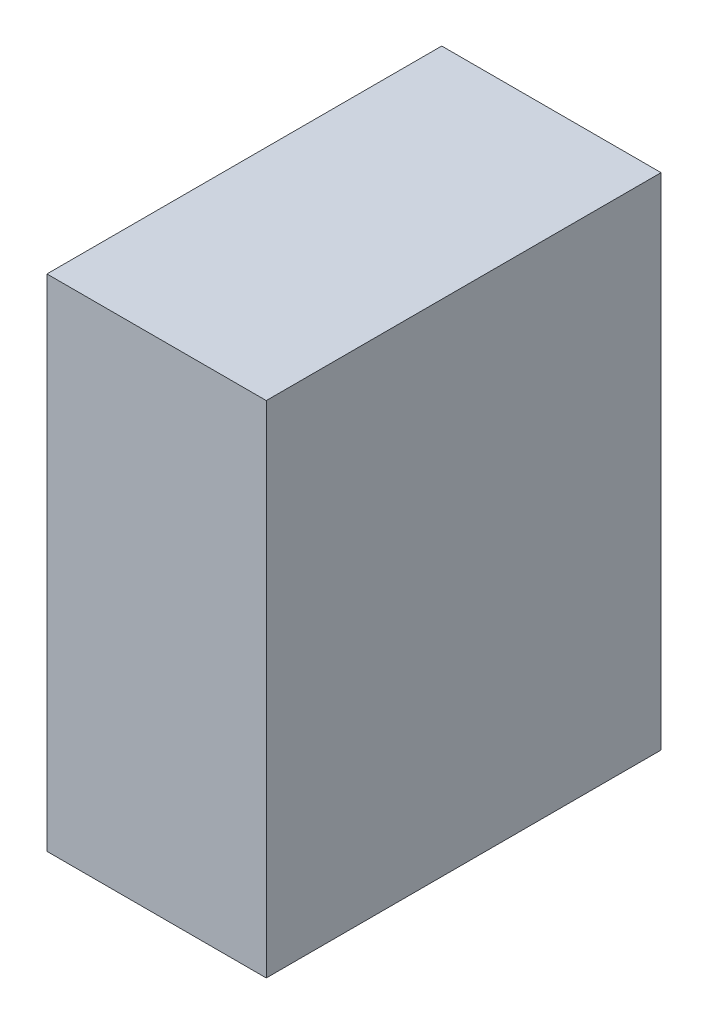
ISO-10303-21;
HEADER;
FILE_DESCRIPTION(('STEP AP214'),'2;1');
FILE_NAME('part.step','',(''),(''),'','','');
FILE_SCHEMA(('AUTOMOTIVE_DESIGN { 1 0 10303 214 1 1 1 1 }'));
ENDSEC;
DATA;
#1=APPLICATION_CONTEXT('core data for automotive mechanical design processes');
#2=APPLICATION_PROTOCOL_DEFINITION('international standard','automotive_design',2000,#1);
#3=PRODUCT_CONTEXT('',#1,'mechanical');
#4=PRODUCT('Part','Part','',(#3));
#5=PRODUCT_RELATED_PRODUCT_CATEGORY('part','',(#4));
#6=PRODUCT_DEFINITION_FORMATION('','',#4);
#7=PRODUCT_DEFINITION_CONTEXT('part definition',#1,'design');
#8=PRODUCT_DEFINITION('design','',#6,#7);
#9=PRODUCT_DEFINITION_SHAPE('','',#8);
#10=(LENGTH_UNIT() NAMED_UNIT(*) SI_UNIT(.MILLI.,.METRE.));
#11=(NAMED_UNIT(*) PLANE_ANGLE_UNIT() SI_UNIT($,.RADIAN.));
#12=(NAMED_UNIT(*) SI_UNIT($,.STERADIAN.) SOLID_ANGLE_UNIT());
#13=UNCERTAINTY_MEASURE_WITH_UNIT(LENGTH_MEASURE(1.E-05),#10,'distance_accuracy_value','');
#14=(GEOMETRIC_REPRESENTATION_CONTEXT(3) GLOBAL_UNCERTAINTY_ASSIGNED_CONTEXT((#13)) GLOBAL_UNIT_ASSIGNED_CONTEXT((#10,
#11,#12)) REPRESENTATION_CONTEXT('',''));
#15=CARTESIAN_POINT('',(0.,0.,0.));
#16=DIRECTION('',(0.,0.,1.));
#17=DIRECTION('',(1.,0.,0.));
#18=AXIS2_PLACEMENT_3D('',#15,#16,#17);
#19=CARTESIAN_POINT('',(0.,0.,90.));
#20=DIRECTION('',(1.,0.,0.));
#21=DIRECTION('',(0.,0.,-1.));
#22=AXIS2_PLACEMENT_3D('',#19,#20,#21);
#23=PLANE('',#22);
#24=DIRECTION('',(0.,-1.,0.));
#25=VECTOR('',#24,1.);
#26=CARTESIAN_POINT('',(0.,0.,0.));
#27=LINE('',#26,#25);
#28=CARTESIAN_POINT('',(0.,114.,0.));
#29=VERTEX_POINT('',#28);
#30=CARTESIAN_POINT('',(0.,0.,0.));
#31=VERTEX_POINT('',#30);
#32=EDGE_CURVE('E98',#29,#31,#27,.T.);
#33=ORIENTED_EDGE('',*,*,#32,.T.);
#34=DIRECTION('',(0.,0.,-1.));
#35=VECTOR('',#34,1.);
#36=CARTESIAN_POINT('',(0.,0.,90.));
#37=LINE('',#36,#35);
#38=CARTESIAN_POINT('',(0.,0.,90.));
#39=VERTEX_POINT('',#38);
#40=EDGE_CURVE('E11',#39,#31,#37,.T.);
#41=ORIENTED_EDGE('',*,*,#40,.F.);
#42=DIRECTION('',(0.,-1.,0.));
#43=VECTOR('',#42,1.);
#44=CARTESIAN_POINT('',(0.,0.,90.));
#45=LINE('',#44,#43);
#46=CARTESIAN_POINT('',(0.,114.,90.));
#47=VERTEX_POINT('',#46);
#48=EDGE_CURVE('E86',#47,#39,#45,.T.);
#49=ORIENTED_EDGE('',*,*,#48,.F.);
#50=DIRECTION('',(0.,0.,-1.));
#51=VECTOR('',#50,1.);
#52=CARTESIAN_POINT('',(0.,114.,90.));
#53=LINE('',#52,#51);
#54=EDGE_CURVE('E94',#47,#29,#53,.T.);
#55=ORIENTED_EDGE('',*,*,#54,.T.);
#56=EDGE_LOOP('',(#33,#41,#49,#55));
#57=FACE_BOUND('',#56,.T.);
#58=ADVANCED_FACE('F35',(#57),#23,.F.);
#59=CARTESIAN_POINT('',(0.,0.,90.));
#60=DIRECTION('',(0.,1.,0.));
#61=DIRECTION('',(0.,0.,1.));
#62=AXIS2_PLACEMENT_3D('',#59,#60,#61);
#63=PLANE('',#62);
#64=DIRECTION('',(1.,0.,0.));
#65=VECTOR('',#64,1.);
#66=CARTESIAN_POINT('',(0.,0.,0.));
#67=LINE('',#66,#65);
#68=CARTESIAN_POINT('',(50.,0.,0.));
#69=VERTEX_POINT('',#68);
#70=EDGE_CURVE('E90',#31,#69,#67,.T.);
#71=ORIENTED_EDGE('',*,*,#70,.T.);
#72=DIRECTION('',(0.,0.,-1.));
#73=VECTOR('',#72,1.);
#74=CARTESIAN_POINT('',(50.,0.,90.));
#75=LINE('',#74,#73);
#76=CARTESIAN_POINT('',(50.,0.,90.));
#77=VERTEX_POINT('',#76);
#78=EDGE_CURVE('E43',#77,#69,#75,.T.);
#79=ORIENTED_EDGE('',*,*,#78,.F.);
#80=DIRECTION('',(1.,0.,0.));
#81=VECTOR('',#80,1.);
#82=CARTESIAN_POINT('',(0.,0.,90.));
#83=LINE('',#82,#81);
#84=EDGE_CURVE('E81',#39,#77,#83,.T.);
#85=ORIENTED_EDGE('',*,*,#84,.F.);
#86=ORIENTED_EDGE('',*,*,#40,.T.);
#87=EDGE_LOOP('',(#71,#79,#85,#86));
#88=FACE_BOUND('',#87,.T.);
#89=ADVANCED_FACE('F89',(#88),#63,.F.);
#90=CARTESIAN_POINT('',(50.,0.,90.));
#91=DIRECTION('',(-1.,0.,0.));
#92=DIRECTION('',(0.,0.,1.));
#93=AXIS2_PLACEMENT_3D('',#90,#91,#92);
#94=PLANE('',#93);
#95=DIRECTION('',(0.,1.,0.));
#96=VECTOR('',#95,1.);
#97=CARTESIAN_POINT('',(50.,0.,0.));
#98=LINE('',#97,#96);
#99=CARTESIAN_POINT('',(50.,114.,0.));
#100=VERTEX_POINT('',#99);
#101=EDGE_CURVE('E68',#69,#100,#98,.T.);
#102=ORIENTED_EDGE('',*,*,#101,.T.);
#103=DIRECTION('',(0.,0.,-1.));
#104=VECTOR('',#103,1.);
#105=CARTESIAN_POINT('',(50.,114.,90.));
#106=LINE('',#105,#104);
#107=CARTESIAN_POINT('',(50.,114.,90.));
#108=VERTEX_POINT('',#107);
#109=EDGE_CURVE('E91',#108,#100,#106,.T.);
#110=ORIENTED_EDGE('',*,*,#109,.F.);
#111=DIRECTION('',(0.,1.,0.));
#112=VECTOR('',#111,1.);
#113=CARTESIAN_POINT('',(50.,0.,90.));
#114=LINE('',#113,#112);
#115=EDGE_CURVE('E84',#77,#108,#114,.T.);
#116=ORIENTED_EDGE('',*,*,#115,.F.);
#117=ORIENTED_EDGE('',*,*,#78,.T.);
#118=EDGE_LOOP('',(#102,#110,#116,#117));
#119=FACE_BOUND('',#118,.T.);
#120=ADVANCED_FACE('F92',(#119),#94,.F.);
#121=CARTESIAN_POINT('',(0.,114.,90.));
#122=DIRECTION('',(0.,-1.,0.));
#123=DIRECTION('',(0.,0.,-1.));
#124=AXIS2_PLACEMENT_3D('',#121,#122,#123);
#125=PLANE('',#124);
#126=DIRECTION('',(-1.,0.,0.));
#127=VECTOR('',#126,1.);
#128=CARTESIAN_POINT('',(0.,114.,0.));
#129=LINE('',#128,#127);
#130=EDGE_CURVE('E74',#100,#29,#129,.T.);
#131=ORIENTED_EDGE('',*,*,#130,.T.);
#132=ORIENTED_EDGE('',*,*,#54,.F.);
#133=DIRECTION('',(-1.,0.,0.));
#134=VECTOR('',#133,1.);
#135=CARTESIAN_POINT('',(0.,114.,90.));
#136=LINE('',#135,#134);
#137=EDGE_CURVE('E51',#108,#47,#136,.T.);
#138=ORIENTED_EDGE('',*,*,#137,.F.);
#139=ORIENTED_EDGE('',*,*,#109,.T.);
#140=EDGE_LOOP('',(#131,#132,#138,#139));
#141=FACE_BOUND('',#140,.T.);
#142=ADVANCED_FACE('F105',(#141),#125,.F.);
#143=CARTESIAN_POINT('',(0.,0.,90.));
#144=DIRECTION('',(0.,0.,-1.));
#145=DIRECTION('',(-1.,0.,0.));
#146=AXIS2_PLACEMENT_3D('',#143,#144,#145);
#147=PLANE('',#146);
#148=ORIENTED_EDGE('',*,*,#48,.T.);
#149=ORIENTED_EDGE('',*,*,#84,.T.);
#150=ORIENTED_EDGE('',*,*,#115,.T.);
#151=ORIENTED_EDGE('',*,*,#137,.T.);
#152=EDGE_LOOP('',(#148,#149,#150,#151));
#153=FACE_BOUND('',#152,.T.);
#154=ADVANCED_FACE('F82',(#153),#147,.F.);
#155=CARTESIAN_POINT('',(0.,0.,0.));
#156=DIRECTION('',(0.,0.,-1.));
#157=DIRECTION('',(-1.,0.,0.));
#158=AXIS2_PLACEMENT_3D('',#155,#156,#157);
#159=PLANE('',#158);
#160=ORIENTED_EDGE('',*,*,#32,.F.);
#161=ORIENTED_EDGE('',*,*,#130,.F.);
#162=ORIENTED_EDGE('',*,*,#101,.F.);
#163=ORIENTED_EDGE('',*,*,#70,.F.);
#164=EDGE_LOOP('',(#160,#161,#162,#163));
#165=FACE_BOUND('',#164,.T.);
#166=ADVANCED_FACE('F108',(#165),#159,.T.);
#167=CLOSED_SHELL('',(#58,#89,#120,#142,#154,#166));
#168=MANIFOLD_SOLID_BREP('B2',#167);
#169=ADVANCED_BREP_SHAPE_REPRESENTATION('',(#18,#168),#14);
#170=SHAPE_DEFINITION_REPRESENTATION(#9,#169);
ENDSEC;
END-ISO-10303-21;
